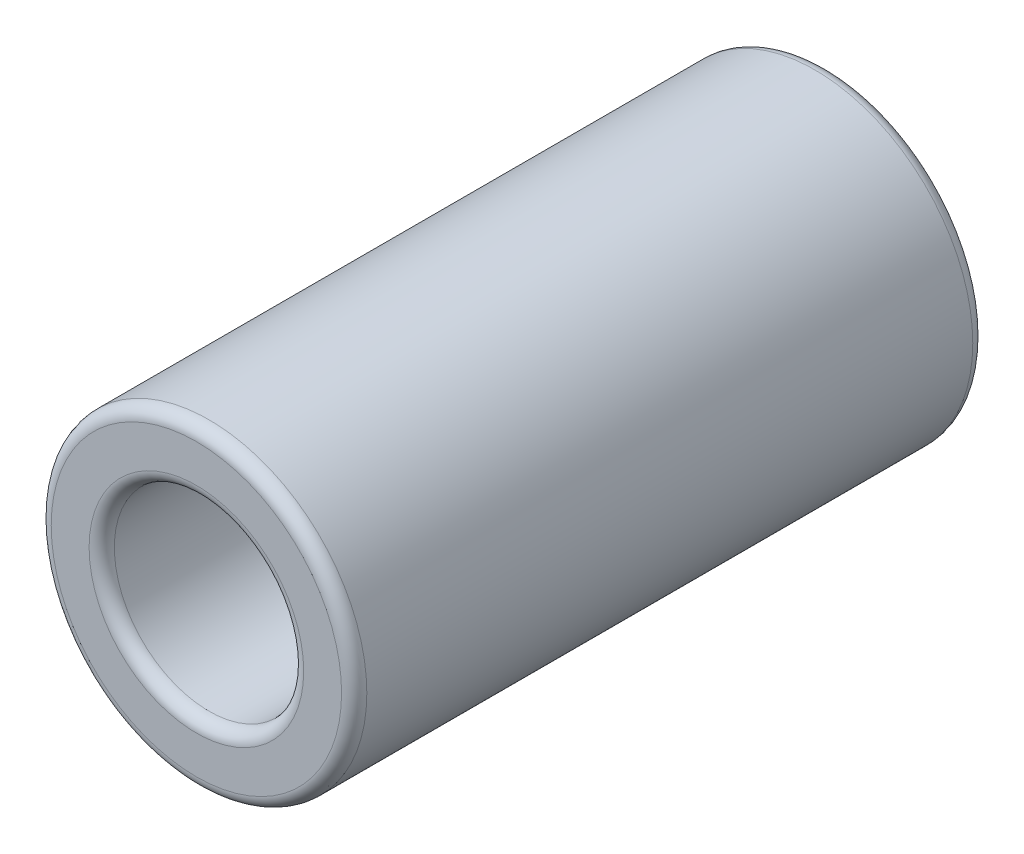
ISO-10303-21;
HEADER;
FILE_DESCRIPTION(('STEP AP214'),'2;1');
FILE_NAME('part.step','',(''),(''),'','','');
FILE_SCHEMA(('AUTOMOTIVE_DESIGN { 1 0 10303 214 1 1 1 1 }'));
ENDSEC;
DATA;
#1=APPLICATION_CONTEXT('core data for automotive mechanical design processes');
#2=APPLICATION_PROTOCOL_DEFINITION('international standard','automotive_design',2000,#1);
#3=PRODUCT_CONTEXT('',#1,'mechanical');
#4=PRODUCT('Part','Part','',(#3));
#5=PRODUCT_RELATED_PRODUCT_CATEGORY('part','',(#4));
#6=PRODUCT_DEFINITION_FORMATION('','',#4);
#7=PRODUCT_DEFINITION_CONTEXT('part definition',#1,'design');
#8=PRODUCT_DEFINITION('design','',#6,#7);
#9=PRODUCT_DEFINITION_SHAPE('','',#8);
#10=(LENGTH_UNIT() NAMED_UNIT(*) SI_UNIT(.MILLI.,.METRE.));
#11=(NAMED_UNIT(*) PLANE_ANGLE_UNIT() SI_UNIT($,.RADIAN.));
#12=(NAMED_UNIT(*) SI_UNIT($,.STERADIAN.) SOLID_ANGLE_UNIT());
#13=UNCERTAINTY_MEASURE_WITH_UNIT(LENGTH_MEASURE(1.E-05),#10,'distance_accuracy_value','');
#14=(GEOMETRIC_REPRESENTATION_CONTEXT(3) GLOBAL_UNCERTAINTY_ASSIGNED_CONTEXT((#13)) GLOBAL_UNIT_ASSIGNED_CONTEXT((#10,
#11,#12)) REPRESENTATION_CONTEXT('',''));
#15=CARTESIAN_POINT('',(0.,0.,0.));
#16=DIRECTION('',(0.,0.,1.));
#17=DIRECTION('',(1.,0.,0.));
#18=AXIS2_PLACEMENT_3D('',#15,#16,#17);
#19=CARTESIAN_POINT('',(0.,0.,10.));
#20=DIRECTION('',(0.,0.,1.));
#21=DIRECTION('',(1.,0.,0.));
#22=AXIS2_PLACEMENT_3D('',#19,#20,#21);
#23=PLANE('',#22);
#24=CARTESIAN_POINT('',(0.,0.,10.));
#25=DIRECTION('',(0.,0.,1.));
#26=DIRECTION('',(1.,0.,0.));
#27=AXIS2_PLACEMENT_3D('',#24,#25,#26);
#28=CIRCLE('',#27,1.7);
#29=CARTESIAN_POINT('',(1.7,0.,10.));
#30=VERTEX_POINT('',#29);
#31=EDGE_CURVE('E10',#30,#30,#28,.F.);
#32=ORIENTED_EDGE('',*,*,#31,.T.);
#33=EDGE_LOOP('',(#32));
#34=FACE_BOUND('',#33,.T.);
#35=CARTESIAN_POINT('',(0.,0.,10.));
#36=DIRECTION('',(0.,0.,1.));
#37=DIRECTION('',(1.,0.,0.));
#38=AXIS2_PLACEMENT_3D('',#35,#36,#37);
#39=CIRCLE('',#38,2.3);
#40=CARTESIAN_POINT('',(2.3,0.,10.));
#41=VERTEX_POINT('',#40);
#42=EDGE_CURVE('E39',#41,#41,#39,.T.);
#43=ORIENTED_EDGE('',*,*,#42,.T.);
#44=EDGE_LOOP('',(#43));
#45=FACE_BOUND('',#44,.T.);
#46=ADVANCED_FACE('F32',(#34,#45),#23,.T.);
#47=CARTESIAN_POINT('',(0.,0.,0.));
#48=DIRECTION('',(0.,0.,1.));
#49=DIRECTION('',(1.,0.,0.));
#50=AXIS2_PLACEMENT_3D('',#47,#48,#49);
#51=PLANE('',#50);
#52=CARTESIAN_POINT('',(0.,0.,0.));
#53=DIRECTION('',(0.,0.,1.));
#54=DIRECTION('',(1.,0.,0.));
#55=AXIS2_PLACEMENT_3D('',#52,#53,#54);
#56=CIRCLE('',#55,2.3);
#57=CARTESIAN_POINT('',(2.3,0.,0.));
#58=VERTEX_POINT('',#57);
#59=EDGE_CURVE('E52',#58,#58,#56,.F.);
#60=ORIENTED_EDGE('',*,*,#59,.T.);
#61=EDGE_LOOP('',(#60));
#62=FACE_BOUND('',#61,.T.);
#63=CARTESIAN_POINT('',(0.,0.,0.));
#64=DIRECTION('',(0.,0.,1.));
#65=DIRECTION('',(1.,0.,0.));
#66=AXIS2_PLACEMENT_3D('',#63,#64,#65);
#67=CIRCLE('',#66,1.7);
#68=CARTESIAN_POINT('',(1.7,0.,0.));
#69=VERTEX_POINT('',#68);
#70=EDGE_CURVE('E55',#69,#69,#67,.T.);
#71=ORIENTED_EDGE('',*,*,#70,.T.);
#72=EDGE_LOOP('',(#71));
#73=FACE_BOUND('',#72,.T.);
#74=ADVANCED_FACE('F76',(#62,#73),#51,.F.);
#75=CARTESIAN_POINT('',(0.,0.,10.));
#76=DIRECTION('',(0.,0.,-1.));
#77=DIRECTION('',(-1.,0.,0.));
#78=AXIS2_PLACEMENT_3D('',#75,#76,#77);
#79=CYLINDRICAL_SURFACE('',#78,2.5);
#80=CARTESIAN_POINT('',(0.,0.,0.200000000000001));
#81=DIRECTION('',(0.,0.,1.));
#82=DIRECTION('',(1.,0.,0.));
#83=AXIS2_PLACEMENT_3D('',#80,#81,#82);
#84=CIRCLE('',#83,2.5);
#85=CARTESIAN_POINT('',(2.5,0.,0.200000000000001));
#86=VERTEX_POINT('',#85);
#87=EDGE_CURVE('E58',#86,#86,#84,.T.);
#88=ORIENTED_EDGE('',*,*,#87,.T.);
#89=EDGE_LOOP('',(#88));
#90=FACE_BOUND('',#89,.T.);
#91=CARTESIAN_POINT('',(0.,0.,9.8));
#92=DIRECTION('',(0.,0.,1.));
#93=DIRECTION('',(1.,0.,0.));
#94=AXIS2_PLACEMENT_3D('',#91,#92,#93);
#95=CIRCLE('',#94,2.5);
#96=CARTESIAN_POINT('',(2.5,0.,9.8));
#97=VERTEX_POINT('',#96);
#98=EDGE_CURVE('E61',#97,#97,#95,.F.);
#99=ORIENTED_EDGE('',*,*,#98,.T.);
#100=EDGE_LOOP('',(#99));
#101=FACE_BOUND('',#100,.T.);
#102=ADVANCED_FACE('F65',(#90,#101),#79,.T.);
#103=CARTESIAN_POINT('',(0.,0.,10.));
#104=DIRECTION('',(0.,0.,-1.));
#105=DIRECTION('',(-1.,0.,0.));
#106=AXIS2_PLACEMENT_3D('',#103,#104,#105);
#107=CYLINDRICAL_SURFACE('',#106,1.5);
#108=CARTESIAN_POINT('',(0.,0.,0.200000000000001));
#109=DIRECTION('',(0.,0.,1.));
#110=DIRECTION('',(1.,0.,0.));
#111=AXIS2_PLACEMENT_3D('',#108,#109,#110);
#112=CIRCLE('',#111,1.5);
#113=CARTESIAN_POINT('',(1.5,0.,0.200000000000001));
#114=VERTEX_POINT('',#113);
#115=EDGE_CURVE('E43',#114,#114,#112,.F.);
#116=ORIENTED_EDGE('',*,*,#115,.T.);
#117=EDGE_LOOP('',(#116));
#118=FACE_BOUND('',#117,.T.);
#119=CARTESIAN_POINT('',(0.,0.,9.8));
#120=DIRECTION('',(0.,0.,1.));
#121=DIRECTION('',(1.,0.,0.));
#122=AXIS2_PLACEMENT_3D('',#119,#120,#121);
#123=CIRCLE('',#122,1.5);
#124=CARTESIAN_POINT('',(1.5,0.,9.8));
#125=VERTEX_POINT('',#124);
#126=EDGE_CURVE('E47',#125,#125,#123,.T.);
#127=ORIENTED_EDGE('',*,*,#126,.T.);
#128=EDGE_LOOP('',(#127));
#129=FACE_BOUND('',#128,.T.);
#130=ADVANCED_FACE('F84',(#118,#129),#107,.F.);
#131=CARTESIAN_POINT('',(0.,0.,0.200000000000001));
#132=DIRECTION('',(0.,0.,1.));
#133=DIRECTION('',(1.,0.,0.));
#134=AXIS2_PLACEMENT_3D('',#131,#132,#133);
#135=TOROIDAL_SURFACE('',#134,2.3,0.2);
#136=ORIENTED_EDGE('',*,*,#59,.F.);
#137=EDGE_LOOP('',(#136));
#138=FACE_BOUND('',#137,.T.);
#139=ORIENTED_EDGE('',*,*,#87,.F.);
#140=EDGE_LOOP('',(#139));
#141=FACE_BOUND('',#140,.T.);
#142=ADVANCED_FACE('F89',(#138,#141),#135,.T.);
#143=CARTESIAN_POINT('',(0.,0.,0.200000000000001));
#144=DIRECTION('',(0.,0.,1.));
#145=DIRECTION('',(1.,0.,0.));
#146=AXIS2_PLACEMENT_3D('',#143,#144,#145);
#147=TOROIDAL_SURFACE('',#146,1.7,0.2);
#148=ORIENTED_EDGE('',*,*,#115,.F.);
#149=EDGE_LOOP('',(#148));
#150=FACE_BOUND('',#149,.T.);
#151=ORIENTED_EDGE('',*,*,#70,.F.);
#152=EDGE_LOOP('',(#151));
#153=FACE_BOUND('',#152,.T.);
#154=ADVANCED_FACE('F73',(#150,#153),#147,.T.);
#155=CARTESIAN_POINT('',(0.,0.,9.8));
#156=DIRECTION('',(0.,0.,1.));
#157=DIRECTION('',(1.,0.,0.));
#158=AXIS2_PLACEMENT_3D('',#155,#156,#157);
#159=TOROIDAL_SURFACE('',#158,1.7,0.2);
#160=ORIENTED_EDGE('',*,*,#31,.F.);
#161=EDGE_LOOP('',(#160));
#162=FACE_BOUND('',#161,.T.);
#163=ORIENTED_EDGE('',*,*,#126,.F.);
#164=EDGE_LOOP('',(#163));
#165=FACE_BOUND('',#164,.T.);
#166=ADVANCED_FACE('F69',(#162,#165),#159,.T.);
#167=CARTESIAN_POINT('',(0.,0.,9.8));
#168=DIRECTION('',(0.,0.,1.));
#169=DIRECTION('',(1.,0.,0.));
#170=AXIS2_PLACEMENT_3D('',#167,#168,#169);
#171=TOROIDAL_SURFACE('',#170,2.3,0.2);
#172=ORIENTED_EDGE('',*,*,#98,.F.);
#173=EDGE_LOOP('',(#172));
#174=FACE_BOUND('',#173,.T.);
#175=ORIENTED_EDGE('',*,*,#42,.F.);
#176=EDGE_LOOP('',(#175));
#177=FACE_BOUND('',#176,.T.);
#178=ADVANCED_FACE('F34',(#174,#177),#171,.T.);
#179=CLOSED_SHELL('',(#46,#74,#102,#130,#142,#154,#166,#178));
#180=MANIFOLD_SOLID_BREP('B2',#179);
#181=ADVANCED_BREP_SHAPE_REPRESENTATION('',(#18,#180),#14);
#182=SHAPE_DEFINITION_REPRESENTATION(#9,#181);
ENDSEC;
END-ISO-10303-21;
